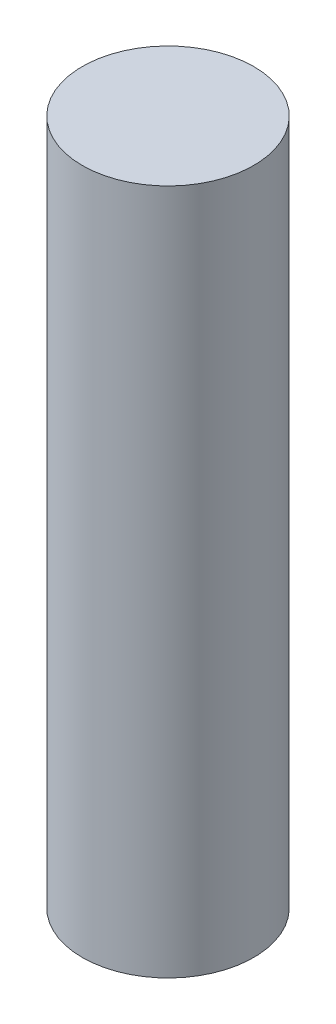
ISO-10303-21;
HEADER;
FILE_DESCRIPTION(('STEP AP214'),'2;1');
FILE_NAME('part.step','',(''),(''),'','','');
FILE_SCHEMA(('AUTOMOTIVE_DESIGN { 1 0 10303 214 1 1 1 1 }'));
ENDSEC;
DATA;
#1=APPLICATION_CONTEXT('core data for automotive mechanical design processes');
#2=APPLICATION_PROTOCOL_DEFINITION('international standard','automotive_design',2000,#1);
#3=PRODUCT_CONTEXT('',#1,'mechanical');
#4=PRODUCT('Part','Part','',(#3));
#5=PRODUCT_RELATED_PRODUCT_CATEGORY('part','',(#4));
#6=PRODUCT_DEFINITION_FORMATION('','',#4);
#7=PRODUCT_DEFINITION_CONTEXT('part definition',#1,'design');
#8=PRODUCT_DEFINITION('design','',#6,#7);
#9=PRODUCT_DEFINITION_SHAPE('','',#8);
#10=(LENGTH_UNIT() NAMED_UNIT(*) SI_UNIT(.MILLI.,.METRE.));
#11=(NAMED_UNIT(*) PLANE_ANGLE_UNIT() SI_UNIT($,.RADIAN.));
#12=(NAMED_UNIT(*) SI_UNIT($,.STERADIAN.) SOLID_ANGLE_UNIT());
#13=UNCERTAINTY_MEASURE_WITH_UNIT(LENGTH_MEASURE(1.E-05),#10,'distance_accuracy_value','');
#14=(GEOMETRIC_REPRESENTATION_CONTEXT(3) GLOBAL_UNCERTAINTY_ASSIGNED_CONTEXT((#13)) GLOBAL_UNIT_ASSIGNED_CONTEXT((#10,
#11,#12)) REPRESENTATION_CONTEXT('',''));
#15=CARTESIAN_POINT('',(0.,0.,0.));
#16=DIRECTION('',(0.,0.,1.));
#17=DIRECTION('',(1.,0.,0.));
#18=AXIS2_PLACEMENT_3D('',#15,#16,#17);
#19=CARTESIAN_POINT('',(0.,76.2,0.));
#20=DIRECTION('',(0.,-1.,0.));
#21=DIRECTION('',(0.,0.,-1.));
#22=AXIS2_PLACEMENT_3D('',#19,#20,#21);
#23=CYLINDRICAL_SURFACE('',#22,9.525);
#24=CARTESIAN_POINT('',(0.,76.2,0.));
#25=DIRECTION('',(0.,1.,0.));
#26=DIRECTION('',(0.,0.,1.));
#27=AXIS2_PLACEMENT_3D('',#24,#25,#26);
#28=CIRCLE('',#27,9.525);
#29=CARTESIAN_POINT('',(0.,76.2,-9.525));
#30=VERTEX_POINT('',#29);
#31=EDGE_CURVE('E10',#30,#30,#28,.T.);
#32=CARTESIAN_POINT('',(0.,0.,0.));
#33=DIRECTION('',(0.,1.,0.));
#34=DIRECTION('',(0.,0.,1.));
#35=AXIS2_PLACEMENT_3D('',#32,#33,#34);
#36=CIRCLE('',#35,9.525);
#37=CARTESIAN_POINT('',(0.,0.,-9.525));
#38=VERTEX_POINT('',#37);
#39=EDGE_CURVE('E31',#38,#38,#36,.T.);
#40=CARTESIAN_POINT('',(0.,76.2,-9.525));
#41=CARTESIAN_POINT('',(0.,75.40625,-9.525));
#42=CARTESIAN_POINT('',(0.,74.6125,-9.525));
#43=CARTESIAN_POINT('',(0.,73.025,-9.525));
#44=CARTESIAN_POINT('',(0.,72.23125,-9.525));
#45=CARTESIAN_POINT('',(0.,70.64375,-9.525));
#46=CARTESIAN_POINT('',(0.,69.85,-9.525));
#47=CARTESIAN_POINT('',(0.,68.2625,-9.525));
#48=CARTESIAN_POINT('',(0.,67.46875,-9.525));
#49=CARTESIAN_POINT('',(0.,65.88125,-9.525));
#50=CARTESIAN_POINT('',(0.,65.0875,-9.525));
#51=CARTESIAN_POINT('',(0.,63.5,-9.525));
#52=CARTESIAN_POINT('',(0.,62.70625,-9.525));
#53=CARTESIAN_POINT('',(0.,61.11875,-9.525));
#54=CARTESIAN_POINT('',(0.,60.325,-9.525));
#55=CARTESIAN_POINT('',(0.,58.7375,-9.525));
#56=CARTESIAN_POINT('',(0.,57.94375,-9.525));
#57=CARTESIAN_POINT('',(0.,56.35625,-9.525));
#58=CARTESIAN_POINT('',(0.,55.5625,-9.525));
#59=CARTESIAN_POINT('',(0.,53.975,-9.525));
#60=CARTESIAN_POINT('',(0.,53.18125,-9.525));
#61=CARTESIAN_POINT('',(0.,51.59375,-9.525));
#62=CARTESIAN_POINT('',(0.,50.8,-9.525));
#63=CARTESIAN_POINT('',(0.,49.2125,-9.525));
#64=CARTESIAN_POINT('',(0.,48.41875,-9.525));
#65=CARTESIAN_POINT('',(0.,46.83125,-9.525));
#66=CARTESIAN_POINT('',(0.,46.0375,-9.525));
#67=CARTESIAN_POINT('',(0.,44.45,-9.525));
#68=CARTESIAN_POINT('',(0.,43.65625,-9.525));
#69=CARTESIAN_POINT('',(0.,42.06875,-9.525));
#70=CARTESIAN_POINT('',(0.,41.275,-9.525));
#71=CARTESIAN_POINT('',(0.,39.6875,-9.525));
#72=CARTESIAN_POINT('',(0.,38.89375,-9.525));
#73=CARTESIAN_POINT('',(0.,37.30625,-9.525));
#74=CARTESIAN_POINT('',(0.,36.5125,-9.525));
#75=CARTESIAN_POINT('',(0.,34.925,-9.525));
#76=CARTESIAN_POINT('',(0.,34.13125,-9.525));
#77=CARTESIAN_POINT('',(0.,32.54375,-9.525));
#78=CARTESIAN_POINT('',(0.,31.75,-9.525));
#79=CARTESIAN_POINT('',(0.,30.1625,-9.525));
#80=CARTESIAN_POINT('',(0.,29.36875,-9.525));
#81=CARTESIAN_POINT('',(0.,27.78125,-9.525));
#82=CARTESIAN_POINT('',(0.,26.9875,-9.525));
#83=CARTESIAN_POINT('',(0.,25.4,-9.525));
#84=CARTESIAN_POINT('',(0.,24.60625,-9.525));
#85=CARTESIAN_POINT('',(0.,23.01875,-9.525));
#86=CARTESIAN_POINT('',(0.,22.225,-9.525));
#87=CARTESIAN_POINT('',(0.,20.6375,-9.525));
#88=CARTESIAN_POINT('',(0.,19.84375,-9.525));
#89=CARTESIAN_POINT('',(0.,18.25625,-9.525));
#90=CARTESIAN_POINT('',(0.,17.4625,-9.525));
#91=CARTESIAN_POINT('',(0.,15.875,-9.525));
#92=CARTESIAN_POINT('',(0.,15.08125,-9.525));
#93=CARTESIAN_POINT('',(0.,13.49375,-9.525));
#94=CARTESIAN_POINT('',(0.,12.7,-9.525));
#95=CARTESIAN_POINT('',(0.,11.1125,-9.525));
#96=CARTESIAN_POINT('',(0.,10.31875,-9.525));
#97=CARTESIAN_POINT('',(0.,8.73125,-9.525));
#98=CARTESIAN_POINT('',(0.,7.93750000000001,-9.525));
#99=CARTESIAN_POINT('',(0.,6.35,-9.525));
#100=CARTESIAN_POINT('',(0.,5.55625,-9.525));
#101=CARTESIAN_POINT('',(0.,3.96875,-9.525));
#102=CARTESIAN_POINT('',(0.,3.175,-9.525));
#103=CARTESIAN_POINT('',(0.,1.5875,-9.525));
#104=CARTESIAN_POINT('',(0.,0.793750000000001,-9.525));
#105=CARTESIAN_POINT('',(0.,0.,-9.525));
#106=B_SPLINE_CURVE_WITH_KNOTS('',3,(#40,#41,#42,#43,#44,#45,#46,#47,#48,#49,#50,#51,#52,#53,
#54,#55,#56,#57,#58,#59,#60,#61,#62,#63,#64,#65,#66,#67,#68,#69,#70,#71,#72,#73,#74,#75,#76,#77,
#78,#79,#80,#81,#82,#83,#84,#85,#86,#87,#88,#89,#90,#91,#92,#93,#94,#95,#96,#97,#98,#99,#100,
#101,#102,#103,#104,#105),.UNSPECIFIED.,.F.,.F.,(4,2,2,2,2,2,2,2,2,2,2,2,2,2,2,2,2,2,2,2,2,2,2,
2,2,2,2,2,2,2,2,2,4),(0.,2.38125,4.7625,7.14375,9.52500000000001,11.90625,14.2875,16.66875,
19.05,21.43125,23.8125,26.19375,28.575,30.95625,33.3375,35.71875,38.1,40.48125,42.8625,45.24375,
47.625,50.00625,52.3875,54.76875,57.15,59.53125,61.9125,64.29375,66.675,69.05625,71.4375,
73.81875,76.2),.UNSPECIFIED.);
#107=EDGE_CURVE('BSEAM28',#30,#38,#106,.T.);
#108=ORIENTED_EDGE('',*,*,#31,.F.);
#109=ORIENTED_EDGE('',*,*,#39,.T.);
#110=ORIENTED_EDGE('',*,*,#107,.T.);
#111=ORIENTED_EDGE('',*,*,#107,.F.);
#112=EDGE_LOOP('',(#108,#110,#109,#111));
#113=FACE_BOUND('',#112,.T.);
#114=ADVANCED_FACE('F28',(#113),#23,.T.);
#115=CARTESIAN_POINT('',(0.,76.2,0.));
#116=DIRECTION('',(0.,1.,0.));
#117=DIRECTION('',(0.,0.,1.));
#118=AXIS2_PLACEMENT_3D('',#115,#116,#117);
#119=PLANE('',#118);
#120=ORIENTED_EDGE('',*,*,#31,.T.);
#121=EDGE_LOOP('',(#120));
#122=FACE_BOUND('',#121,.T.);
#123=ADVANCED_FACE('F43',(#122),#119,.T.);
#124=CARTESIAN_POINT('',(0.,0.,0.));
#125=DIRECTION('',(0.,1.,0.));
#126=DIRECTION('',(0.,0.,1.));
#127=AXIS2_PLACEMENT_3D('',#124,#125,#126);
#128=PLANE('',#127);
#129=ORIENTED_EDGE('',*,*,#39,.F.);
#130=EDGE_LOOP('',(#129));
#131=FACE_BOUND('',#130,.T.);
#132=ADVANCED_FACE('F41',(#131),#128,.F.);
#133=CLOSED_SHELL('',(#114,#123,#132));
#134=MANIFOLD_SOLID_BREP('B2',#133);
#135=ADVANCED_BREP_SHAPE_REPRESENTATION('',(#18,#134),#14);
#136=SHAPE_DEFINITION_REPRESENTATION(#9,#135);
ENDSEC;
END-ISO-10303-21;
